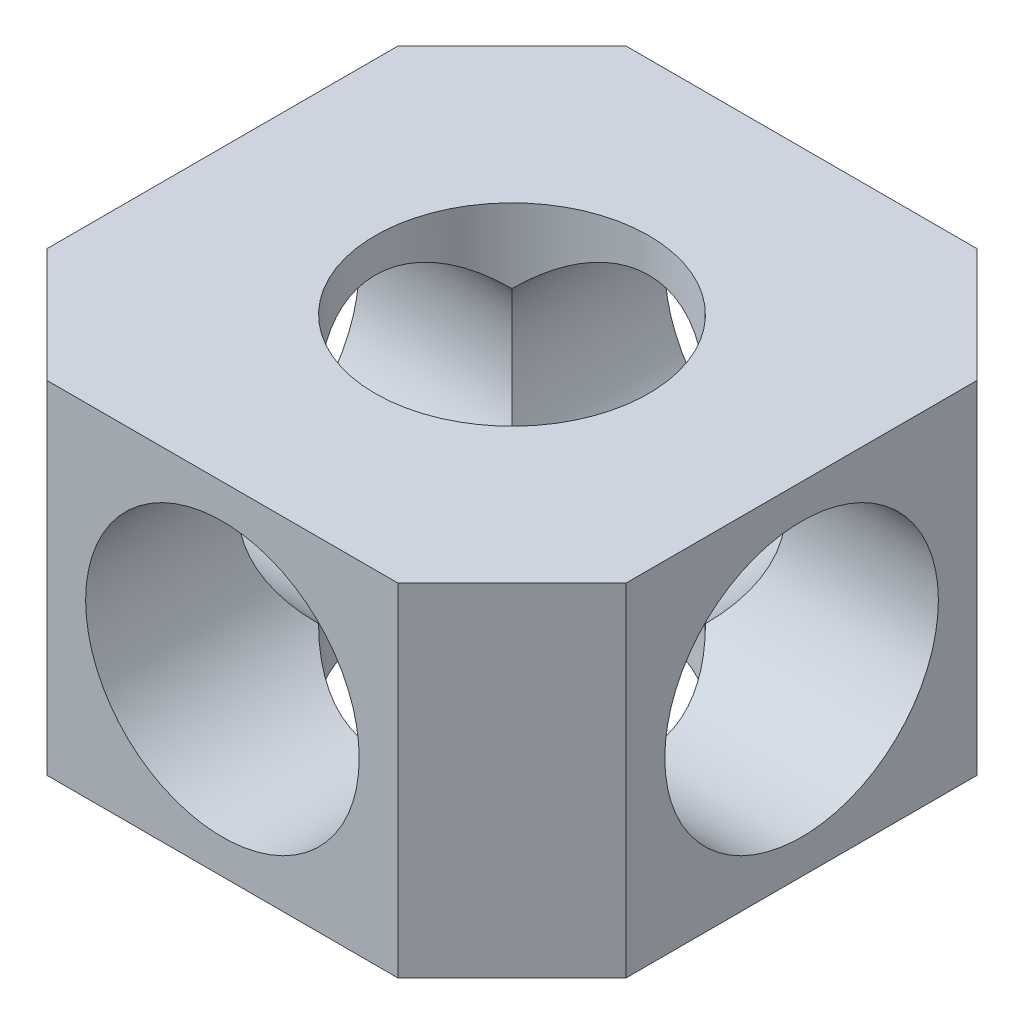
ISO-10303-21;
HEADER;
FILE_DESCRIPTION(('STEP AP214'),'2;1');
FILE_NAME('part.step','',(''),(''),'','','');
FILE_SCHEMA(('AUTOMOTIVE_DESIGN { 1 0 10303 214 1 1 1 1 }'));
ENDSEC;
DATA;
#1=APPLICATION_CONTEXT('core data for automotive mechanical design processes');
#2=APPLICATION_PROTOCOL_DEFINITION('international standard','automotive_design',2000,#1);
#3=PRODUCT_CONTEXT('',#1,'mechanical');
#4=PRODUCT('Part','Part','',(#3));
#5=PRODUCT_RELATED_PRODUCT_CATEGORY('part','',(#4));
#6=PRODUCT_DEFINITION_FORMATION('','',#4);
#7=PRODUCT_DEFINITION_CONTEXT('part definition',#1,'design');
#8=PRODUCT_DEFINITION('design','',#6,#7);
#9=PRODUCT_DEFINITION_SHAPE('','',#8);
#10=(LENGTH_UNIT() NAMED_UNIT(*) SI_UNIT(.MILLI.,.METRE.));
#11=(NAMED_UNIT(*) PLANE_ANGLE_UNIT() SI_UNIT($,.RADIAN.));
#12=(NAMED_UNIT(*) SI_UNIT($,.STERADIAN.) SOLID_ANGLE_UNIT());
#13=UNCERTAINTY_MEASURE_WITH_UNIT(LENGTH_MEASURE(1.E-05),#10,'distance_accuracy_value','');
#14=(GEOMETRIC_REPRESENTATION_CONTEXT(3) GLOBAL_UNCERTAINTY_ASSIGNED_CONTEXT((#13)) GLOBAL_UNIT_ASSIGNED_CONTEXT((#10,
#11,#12)) REPRESENTATION_CONTEXT('',''));
#15=CARTESIAN_POINT('',(0.,0.,0.));
#16=DIRECTION('',(0.,0.,1.));
#17=DIRECTION('',(1.,0.,0.));
#18=AXIS2_PLACEMENT_3D('',#15,#16,#17);
#19=CARTESIAN_POINT('',(0.,7.5,0.));
#20=DIRECTION('',(0.,1.,0.));
#21=DIRECTION('',(0.,0.,1.));
#22=AXIS2_PLACEMENT_3D('',#19,#20,#21);
#23=CYLINDRICAL_SURFACE('',#22,6.00000000000001);
#24=CARTESIAN_POINT('',(0.,7.5,0.));
#25=DIRECTION('',(0.,1.,0.));
#26=DIRECTION('',(0.,0.,1.));
#27=AXIS2_PLACEMENT_3D('',#24,#25,#26);
#28=CIRCLE('',#27,6.00000000000001);
#29=CARTESIAN_POINT('',(0.,7.5,6.00000000000001));
#30=VERTEX_POINT('',#29);
#31=EDGE_CURVE('E181',#30,#30,#28,.T.);
#32=ORIENTED_EDGE('',*,*,#31,.T.);
#33=EDGE_LOOP('',(#32));
#34=FACE_BOUND('',#33,.T.);
#35=CARTESIAN_POINT('',(0.,0.,0.));
#36=DIRECTION('',(0.707106781186547,0.707106781186547,0.));
#37=DIRECTION('',(-0.707106781186547,0.707106781186547,0.));
#38=AXIS2_PLACEMENT_3D('',#35,#36,#37);
#39=ELLIPSE('',#38,8.48528137423858,6.00000000000001);
#40=CARTESIAN_POINT('',(-4.24264068711929,4.24264068711929,4.24264068711929));
#41=VERTEX_POINT('',#40);
#42=CARTESIAN_POINT('',(-4.24264068711929,4.24264068711929,-4.24264068711929));
#43=VERTEX_POINT('',#42);
#44=EDGE_CURVE('E145',#41,#43,#39,.F.);
#45=ORIENTED_EDGE('',*,*,#44,.T.);
#46=CARTESIAN_POINT('',(0.,0.,0.));
#47=DIRECTION('',(0.,0.707106781186547,0.707106781186547));
#48=DIRECTION('',(0.,0.707106781186547,-0.707106781186547));
#49=AXIS2_PLACEMENT_3D('',#46,#47,#48);
#50=ELLIPSE('',#49,8.48528137423858,6.00000000000001);
#51=CARTESIAN_POINT('',(4.24264068711929,4.24264068711929,-4.24264068711929));
#52=VERTEX_POINT('',#51);
#53=EDGE_CURVE('E165',#43,#52,#50,.F.);
#54=ORIENTED_EDGE('',*,*,#53,.T.);
#55=CARTESIAN_POINT('',(0.,0.,0.));
#56=DIRECTION('',(-0.707106781186547,0.707106781186547,0.));
#57=DIRECTION('',(0.707106781186547,0.707106781186547,0.));
#58=AXIS2_PLACEMENT_3D('',#55,#56,#57);
#59=ELLIPSE('',#58,8.48528137423858,6.00000000000001);
#60=CARTESIAN_POINT('',(4.24264068711929,4.24264068711929,4.24264068711929));
#61=VERTEX_POINT('',#60);
#62=EDGE_CURVE('E140',#52,#61,#59,.F.);
#63=ORIENTED_EDGE('',*,*,#62,.T.);
#64=CARTESIAN_POINT('',(0.,0.,0.));
#65=DIRECTION('',(0.,0.707106781186547,-0.707106781186547));
#66=DIRECTION('',(0.,0.707106781186547,0.707106781186547));
#67=AXIS2_PLACEMENT_3D('',#64,#65,#66);
#68=ELLIPSE('',#67,8.48528137423858,6.00000000000001);
#69=EDGE_CURVE('E134',#61,#41,#68,.F.);
#70=ORIENTED_EDGE('',*,*,#69,.T.);
#71=EDGE_LOOP('',(#45,#54,#63,#70));
#72=FACE_BOUND('',#71,.T.);
#73=ADVANCED_FACE('F45',(#34,#72),#23,.F.);
#74=CARTESIAN_POINT('',(12.7,7.5,-12.7));
#75=DIRECTION('',(-1.,0.,0.));
#76=DIRECTION('',(0.,0.,1.));
#77=AXIS2_PLACEMENT_3D('',#74,#75,#76);
#78=PLANE('',#77);
#79=CARTESIAN_POINT('',(12.7,0.,0.));
#80=DIRECTION('',(-1.,0.,0.));
#81=DIRECTION('',(0.,0.,1.));
#82=AXIS2_PLACEMENT_3D('',#79,#80,#81);
#83=CIRCLE('',#82,6.00000000000001);
#84=CARTESIAN_POINT('',(12.7,0.,6.00000000000001));
#85=VERTEX_POINT('',#84);
#86=EDGE_CURVE('E178',#85,#85,#83,.T.);
#87=ORIENTED_EDGE('',*,*,#86,.T.);
#88=EDGE_LOOP('',(#87));
#89=FACE_BOUND('',#88,.T.);
#90=DIRECTION('',(0.,0.,-1.));
#91=VECTOR('',#90,1.);
#92=CARTESIAN_POINT('',(12.7,-7.5,-12.7));
#93=LINE('',#92,#91);
#94=CARTESIAN_POINT('',(12.7,-7.5,7.7));
#95=VERTEX_POINT('',#94);
#96=CARTESIAN_POINT('',(12.7,-7.5,-7.69999999999998));
#97=VERTEX_POINT('',#96);
#98=EDGE_CURVE('E187',#95,#97,#93,.T.);
#99=ORIENTED_EDGE('',*,*,#98,.T.);
#100=DIRECTION('',(0.,1.,0.));
#101=VECTOR('',#100,1.);
#102=CARTESIAN_POINT('',(12.7,7.5,-7.69999999999998));
#103=LINE('',#102,#101);
#104=CARTESIAN_POINT('',(12.7,7.5,-7.69999999999998));
#105=VERTEX_POINT('',#104);
#106=EDGE_CURVE('E151',#97,#105,#103,.T.);
#107=ORIENTED_EDGE('',*,*,#106,.T.);
#108=DIRECTION('',(0.,0.,-1.));
#109=VECTOR('',#108,1.);
#110=CARTESIAN_POINT('',(12.7,7.5,-12.7));
#111=LINE('',#110,#109);
#112=CARTESIAN_POINT('',(12.7,7.5,7.7));
#113=VERTEX_POINT('',#112);
#114=EDGE_CURVE('E188',#113,#105,#111,.T.);
#115=ORIENTED_EDGE('',*,*,#114,.F.);
#116=DIRECTION('',(0.,-1.,0.));
#117=VECTOR('',#116,1.);
#118=CARTESIAN_POINT('',(12.7,7.5,7.7));
#119=LINE('',#118,#117);
#120=EDGE_CURVE('E156',#113,#95,#119,.T.);
#121=ORIENTED_EDGE('',*,*,#120,.T.);
#122=EDGE_LOOP('',(#99,#107,#115,#121));
#123=FACE_BOUND('',#122,.T.);
#124=ADVANCED_FACE('F246',(#89,#123),#78,.F.);
#125=CARTESIAN_POINT('',(-12.7,7.5,-12.7));
#126=DIRECTION('',(0.,0.,1.));
#127=DIRECTION('',(1.,0.,0.));
#128=AXIS2_PLACEMENT_3D('',#125,#126,#127);
#129=PLANE('',#128);
#130=CARTESIAN_POINT('',(0.,0.,-12.7));
#131=DIRECTION('',(0.,0.,1.));
#132=DIRECTION('',(1.,0.,0.));
#133=AXIS2_PLACEMENT_3D('',#130,#131,#132);
#134=CIRCLE('',#133,6.00000000000001);
#135=CARTESIAN_POINT('',(6.00000000000001,0.,-12.7));
#136=VERTEX_POINT('',#135);
#137=EDGE_CURVE('E168',#136,#136,#134,.T.);
#138=ORIENTED_EDGE('',*,*,#137,.T.);
#139=EDGE_LOOP('',(#138));
#140=FACE_BOUND('',#139,.T.);
#141=DIRECTION('',(-1.,0.,0.));
#142=VECTOR('',#141,1.);
#143=CARTESIAN_POINT('',(-12.7,-7.5,-12.7));
#144=LINE('',#143,#142);
#145=CARTESIAN_POINT('',(7.69999999999999,-7.5,-12.7));
#146=VERTEX_POINT('',#145);
#147=CARTESIAN_POINT('',(-7.69999999999998,-7.5,-12.7));
#148=VERTEX_POINT('',#147);
#149=EDGE_CURVE('E204',#146,#148,#144,.T.);
#150=ORIENTED_EDGE('',*,*,#149,.T.);
#151=DIRECTION('',(0.,1.,0.));
#152=VECTOR('',#151,1.);
#153=CARTESIAN_POINT('',(-7.69999999999998,7.5,-12.7));
#154=LINE('',#153,#152);
#155=CARTESIAN_POINT('',(-7.69999999999998,7.5,-12.7));
#156=VERTEX_POINT('',#155);
#157=EDGE_CURVE('E240',#148,#156,#154,.T.);
#158=ORIENTED_EDGE('',*,*,#157,.T.);
#159=DIRECTION('',(-1.,0.,0.));
#160=VECTOR('',#159,1.);
#161=CARTESIAN_POINT('',(-12.7,7.5,-12.7));
#162=LINE('',#161,#160);
#163=CARTESIAN_POINT('',(7.69999999999999,7.5,-12.7));
#164=VERTEX_POINT('',#163);
#165=EDGE_CURVE('E191',#164,#156,#162,.T.);
#166=ORIENTED_EDGE('',*,*,#165,.F.);
#167=DIRECTION('',(0.,-1.,0.));
#168=VECTOR('',#167,1.);
#169=CARTESIAN_POINT('',(7.69999999999999,7.5,-12.7));
#170=LINE('',#169,#168);
#171=EDGE_CURVE('E237',#164,#146,#170,.T.);
#172=ORIENTED_EDGE('',*,*,#171,.T.);
#173=EDGE_LOOP('',(#150,#158,#166,#172));
#174=FACE_BOUND('',#173,.T.);
#175=ADVANCED_FACE('F260',(#140,#174),#129,.F.);
#176=CARTESIAN_POINT('',(-12.7,7.5,-12.7));
#177=DIRECTION('',(1.,0.,0.));
#178=DIRECTION('',(0.,0.,-1.));
#179=AXIS2_PLACEMENT_3D('',#176,#177,#178);
#180=PLANE('',#179);
#181=CARTESIAN_POINT('',(-12.7,0.,0.));
#182=DIRECTION('',(-1.,0.,0.));
#183=DIRECTION('',(0.,0.,1.));
#184=AXIS2_PLACEMENT_3D('',#181,#182,#183);
#185=CIRCLE('',#184,6.00000000000001);
#186=CARTESIAN_POINT('',(-12.7,0.,6.00000000000002));
#187=VERTEX_POINT('',#186);
#188=EDGE_CURVE('E175',#187,#187,#185,.T.);
#189=ORIENTED_EDGE('',*,*,#188,.F.);
#190=EDGE_LOOP('',(#189));
#191=FACE_BOUND('',#190,.T.);
#192=DIRECTION('',(0.,0.,1.));
#193=VECTOR('',#192,1.);
#194=CARTESIAN_POINT('',(-12.7,-7.5,-12.7));
#195=LINE('',#194,#193);
#196=CARTESIAN_POINT('',(-12.7,-7.5,-7.69999999999999));
#197=VERTEX_POINT('',#196);
#198=CARTESIAN_POINT('',(-12.7,-7.5,7.69999999999999));
#199=VERTEX_POINT('',#198);
#200=EDGE_CURVE('E207',#197,#199,#195,.T.);
#201=ORIENTED_EDGE('',*,*,#200,.T.);
#202=DIRECTION('',(0.,1.,0.));
#203=VECTOR('',#202,1.);
#204=CARTESIAN_POINT('',(-12.7,7.5,7.69999999999999));
#205=LINE('',#204,#203);
#206=CARTESIAN_POINT('',(-12.7,7.5,7.69999999999999));
#207=VERTEX_POINT('',#206);
#208=EDGE_CURVE('E227',#199,#207,#205,.T.);
#209=ORIENTED_EDGE('',*,*,#208,.T.);
#210=DIRECTION('',(0.,0.,1.));
#211=VECTOR('',#210,1.);
#212=CARTESIAN_POINT('',(-12.7,7.5,-12.7));
#213=LINE('',#212,#211);
#214=CARTESIAN_POINT('',(-12.7,7.5,-7.69999999999999));
#215=VERTEX_POINT('',#214);
#216=EDGE_CURVE('E195',#215,#207,#213,.T.);
#217=ORIENTED_EDGE('',*,*,#216,.F.);
#218=DIRECTION('',(0.,-1.,0.));
#219=VECTOR('',#218,1.);
#220=CARTESIAN_POINT('',(-12.7,7.5,-7.69999999999999));
#221=LINE('',#220,#219);
#222=EDGE_CURVE('E224',#215,#197,#221,.T.);
#223=ORIENTED_EDGE('',*,*,#222,.T.);
#224=EDGE_LOOP('',(#201,#209,#217,#223));
#225=FACE_BOUND('',#224,.T.);
#226=ADVANCED_FACE('F271',(#191,#225),#180,.F.);
#227=CARTESIAN_POINT('',(-12.7,7.5,12.7));
#228=DIRECTION('',(0.,0.,-1.));
#229=DIRECTION('',(-1.,0.,0.));
#230=AXIS2_PLACEMENT_3D('',#227,#228,#229);
#231=PLANE('',#230);
#232=CARTESIAN_POINT('',(0.,0.,12.7));
#233=DIRECTION('',(0.,0.,1.));
#234=DIRECTION('',(1.,0.,0.));
#235=AXIS2_PLACEMENT_3D('',#232,#233,#234);
#236=CIRCLE('',#235,6.00000000000001);
#237=CARTESIAN_POINT('',(6.00000000000001,0.,12.7));
#238=VERTEX_POINT('',#237);
#239=EDGE_CURVE('E391',#238,#238,#236,.T.);
#240=ORIENTED_EDGE('',*,*,#239,.F.);
#241=EDGE_LOOP('',(#240));
#242=FACE_BOUND('',#241,.T.);
#243=DIRECTION('',(1.,0.,0.));
#244=VECTOR('',#243,1.);
#245=CARTESIAN_POINT('',(-12.7,7.5,12.7));
#246=LINE('',#245,#244);
#247=CARTESIAN_POINT('',(-7.7,7.5,12.7));
#248=VERTEX_POINT('',#247);
#249=CARTESIAN_POINT('',(7.69999999999999,7.5,12.7));
#250=VERTEX_POINT('',#249);
#251=EDGE_CURVE('E198',#248,#250,#246,.T.);
#252=ORIENTED_EDGE('',*,*,#251,.F.);
#253=DIRECTION('',(0.,-1.,0.));
#254=VECTOR('',#253,1.);
#255=CARTESIAN_POINT('',(-7.7,7.5,12.7));
#256=LINE('',#255,#254);
#257=CARTESIAN_POINT('',(-7.7,-7.5,12.7));
#258=VERTEX_POINT('',#257);
#259=EDGE_CURVE('E213',#248,#258,#256,.T.);
#260=ORIENTED_EDGE('',*,*,#259,.T.);
#261=DIRECTION('',(1.,0.,0.));
#262=VECTOR('',#261,1.);
#263=CARTESIAN_POINT('',(-12.7,-7.5,12.7));
#264=LINE('',#263,#262);
#265=CARTESIAN_POINT('',(7.69999999999999,-7.5,12.7));
#266=VERTEX_POINT('',#265);
#267=EDGE_CURVE('E192',#258,#266,#264,.T.);
#268=ORIENTED_EDGE('',*,*,#267,.T.);
#269=DIRECTION('',(0.,1.,0.));
#270=VECTOR('',#269,1.);
#271=CARTESIAN_POINT('',(7.69999999999999,7.5,12.7));
#272=LINE('',#271,#270);
#273=EDGE_CURVE('E201',#266,#250,#272,.T.);
#274=ORIENTED_EDGE('',*,*,#273,.T.);
#275=EDGE_LOOP('',(#252,#260,#268,#274));
#276=FACE_BOUND('',#275,.T.);
#277=ADVANCED_FACE('F279',(#242,#276),#231,.F.);
#278=CARTESIAN_POINT('',(0.,7.5,0.));
#279=DIRECTION('',(0.,1.,0.));
#280=DIRECTION('',(0.,0.,1.));
#281=AXIS2_PLACEMENT_3D('',#278,#279,#280);
#282=PLANE('',#281);
#283=ORIENTED_EDGE('',*,*,#31,.F.);
#284=EDGE_LOOP('',(#283));
#285=FACE_BOUND('',#284,.T.);
#286=ORIENTED_EDGE('',*,*,#216,.T.);
#287=DIRECTION('',(-0.707106781186546,0.,-0.707106781186549));
#288=VECTOR('',#287,1.);
#289=CARTESIAN_POINT('',(-10.2,7.5,10.2));
#290=LINE('',#289,#288);
#291=EDGE_CURVE('E235',#207,#248,#290,.F.);
#292=ORIENTED_EDGE('',*,*,#291,.T.);
#293=ORIENTED_EDGE('',*,*,#251,.T.);
#294=DIRECTION('',(-0.707106781186548,0.,0.707106781186547));
#295=VECTOR('',#294,1.);
#296=CARTESIAN_POINT('',(10.2,7.5,10.2));
#297=LINE('',#296,#295);
#298=EDGE_CURVE('E229',#250,#113,#297,.F.);
#299=ORIENTED_EDGE('',*,*,#298,.T.);
#300=ORIENTED_EDGE('',*,*,#114,.T.);
#301=DIRECTION('',(0.707106781186547,0.,0.707106781186549));
#302=VECTOR('',#301,1.);
#303=CARTESIAN_POINT('',(10.2,7.5,-10.2));
#304=LINE('',#303,#302);
#305=EDGE_CURVE('E231',#105,#164,#304,.F.);
#306=ORIENTED_EDGE('',*,*,#305,.T.);
#307=ORIENTED_EDGE('',*,*,#165,.T.);
#308=DIRECTION('',(0.707106781186549,0.,-0.707106781186546));
#309=VECTOR('',#308,1.);
#310=CARTESIAN_POINT('',(-10.2,7.5,-10.2));
#311=LINE('',#310,#309);
#312=EDGE_CURVE('E233',#156,#215,#311,.F.);
#313=ORIENTED_EDGE('',*,*,#312,.T.);
#314=EDGE_LOOP('',(#286,#292,#293,#299,#300,#306,#307,#313));
#315=FACE_BOUND('',#314,.T.);
#316=ADVANCED_FACE('F264',(#285,#315),#282,.T.);
#317=CARTESIAN_POINT('',(0.,-7.5,0.));
#318=DIRECTION('',(0.,1.,0.));
#319=DIRECTION('',(0.,0.,1.));
#320=AXIS2_PLACEMENT_3D('',#317,#318,#319);
#321=PLANE('',#320);
#322=CARTESIAN_POINT('',(0.,-7.5,0.));
#323=DIRECTION('',(0.,1.,0.));
#324=DIRECTION('',(0.,0.,1.));
#325=AXIS2_PLACEMENT_3D('',#322,#323,#324);
#326=CIRCLE('',#325,6.00000000000001);
#327=CARTESIAN_POINT('',(0.,-7.5,6.00000000000001));
#328=VERTEX_POINT('',#327);
#329=EDGE_CURVE('E184',#328,#328,#326,.T.);
#330=ORIENTED_EDGE('',*,*,#329,.T.);
#331=EDGE_LOOP('',(#330));
#332=FACE_BOUND('',#331,.T.);
#333=ORIENTED_EDGE('',*,*,#267,.F.);
#334=DIRECTION('',(0.707106781186546,0.,0.707106781186549));
#335=VECTOR('',#334,1.);
#336=CARTESIAN_POINT('',(-7.7,-7.5,12.7));
#337=LINE('',#336,#335);
#338=EDGE_CURVE('E222',#258,#199,#337,.F.);
#339=ORIENTED_EDGE('',*,*,#338,.T.);
#340=ORIENTED_EDGE('',*,*,#200,.F.);
#341=DIRECTION('',(-0.707106781186549,0.,0.707106781186546));
#342=VECTOR('',#341,1.);
#343=CARTESIAN_POINT('',(-12.7,-7.5,-7.69999999999999));
#344=LINE('',#343,#342);
#345=EDGE_CURVE('E220',#197,#148,#344,.F.);
#346=ORIENTED_EDGE('',*,*,#345,.T.);
#347=ORIENTED_EDGE('',*,*,#149,.F.);
#348=DIRECTION('',(-0.707106781186547,0.,-0.707106781186549));
#349=VECTOR('',#348,1.);
#350=CARTESIAN_POINT('',(7.69999999999999,-7.5,-12.7));
#351=LINE('',#350,#349);
#352=EDGE_CURVE('E218',#146,#97,#351,.F.);
#353=ORIENTED_EDGE('',*,*,#352,.T.);
#354=ORIENTED_EDGE('',*,*,#98,.F.);
#355=DIRECTION('',(0.707106781186548,0.,-0.707106781186547));
#356=VECTOR('',#355,1.);
#357=CARTESIAN_POINT('',(12.7,-7.5,7.7));
#358=LINE('',#357,#356);
#359=EDGE_CURVE('E216',#95,#266,#358,.F.);
#360=ORIENTED_EDGE('',*,*,#359,.T.);
#361=EDGE_LOOP('',(#333,#339,#340,#346,#347,#353,#354,#360));
#362=FACE_BOUND('',#361,.T.);
#363=ADVANCED_FACE('F252',(#332,#362),#321,.F.);
#364=CARTESIAN_POINT('',(-7.7,7.5,12.7));
#365=DIRECTION('',(0.707106781186549,0.,-0.707106781186546));
#366=DIRECTION('',(0.,-1.,0.));
#367=AXIS2_PLACEMENT_3D('',#364,#365,#366);
#368=PLANE('',#367);
#369=ORIENTED_EDGE('',*,*,#291,.F.);
#370=ORIENTED_EDGE('',*,*,#208,.F.);
#371=ORIENTED_EDGE('',*,*,#338,.F.);
#372=ORIENTED_EDGE('',*,*,#259,.F.);
#373=EDGE_LOOP('',(#369,#370,#371,#372));
#374=FACE_BOUND('',#373,.T.);
#375=ADVANCED_FACE('F276',(#374),#368,.F.);
#376=CARTESIAN_POINT('',(-12.7,7.5,-7.69999999999999));
#377=DIRECTION('',(0.707106781186546,0.,0.707106781186549));
#378=DIRECTION('',(0.,-1.,0.));
#379=AXIS2_PLACEMENT_3D('',#376,#377,#378);
#380=PLANE('',#379);
#381=ORIENTED_EDGE('',*,*,#312,.F.);
#382=ORIENTED_EDGE('',*,*,#157,.F.);
#383=ORIENTED_EDGE('',*,*,#345,.F.);
#384=ORIENTED_EDGE('',*,*,#222,.F.);
#385=EDGE_LOOP('',(#381,#382,#383,#384));
#386=FACE_BOUND('',#385,.T.);
#387=ADVANCED_FACE('F268',(#386),#380,.F.);
#388=CARTESIAN_POINT('',(7.69999999999999,7.5,-12.7));
#389=DIRECTION('',(-0.707106781186549,0.,0.707106781186547));
#390=DIRECTION('',(0.,-1.,0.));
#391=AXIS2_PLACEMENT_3D('',#388,#389,#390);
#392=PLANE('',#391);
#393=ORIENTED_EDGE('',*,*,#305,.F.);
#394=ORIENTED_EDGE('',*,*,#106,.F.);
#395=ORIENTED_EDGE('',*,*,#352,.F.);
#396=ORIENTED_EDGE('',*,*,#171,.F.);
#397=EDGE_LOOP('',(#393,#394,#395,#396));
#398=FACE_BOUND('',#397,.T.);
#399=ADVANCED_FACE('F257',(#398),#392,.F.);
#400=CARTESIAN_POINT('',(12.7,7.5,7.7));
#401=DIRECTION('',(-0.707106781186547,0.,-0.707106781186548));
#402=DIRECTION('',(0.,-1.,0.));
#403=AXIS2_PLACEMENT_3D('',#400,#401,#402);
#404=PLANE('',#403);
#405=ORIENTED_EDGE('',*,*,#298,.F.);
#406=ORIENTED_EDGE('',*,*,#273,.F.);
#407=ORIENTED_EDGE('',*,*,#359,.F.);
#408=ORIENTED_EDGE('',*,*,#120,.F.);
#409=EDGE_LOOP('',(#405,#406,#407,#408));
#410=FACE_BOUND('',#409,.T.);
#411=ADVANCED_FACE('F48',(#410),#404,.F.);
#412=CARTESIAN_POINT('',(0.,0.,0.));
#413=DIRECTION('',(-0.707106781186547,0.707106781186547,0.));
#414=DIRECTION('',(0.707106781186547,0.707106781186547,0.));
#415=AXIS2_PLACEMENT_3D('',#412,#413,#414);
#416=ELLIPSE('',#415,8.48528137423858,6.00000000000001);
#417=CARTESIAN_POINT('',(-4.24264068711929,-4.24264068711929,-4.24264068711929));
#418=VERTEX_POINT('',#417);
#419=CARTESIAN_POINT('',(-4.24264068711929,-4.24264068711929,4.24264068711929));
#420=VERTEX_POINT('',#419);
#421=EDGE_CURVE('E154',#418,#420,#416,.T.);
#422=ORIENTED_EDGE('',*,*,#421,.T.);
#423=CARTESIAN_POINT('',(0.,0.,0.));
#424=DIRECTION('',(0.,0.707106781186547,0.707106781186547));
#425=DIRECTION('',(0.,0.707106781186547,-0.707106781186547));
#426=AXIS2_PLACEMENT_3D('',#423,#424,#425);
#427=ELLIPSE('',#426,8.48528137423858,6.00000000000001);
#428=CARTESIAN_POINT('',(4.24264068711929,-4.24264068711929,4.24264068711929));
#429=VERTEX_POINT('',#428);
#430=EDGE_CURVE('E69',#420,#429,#427,.T.);
#431=ORIENTED_EDGE('',*,*,#430,.T.);
#432=CARTESIAN_POINT('',(0.,0.,0.));
#433=DIRECTION('',(0.707106781186547,0.707106781186547,0.));
#434=DIRECTION('',(-0.707106781186547,0.707106781186547,0.));
#435=AXIS2_PLACEMENT_3D('',#432,#433,#434);
#436=ELLIPSE('',#435,8.48528137423858,6.00000000000001);
#437=CARTESIAN_POINT('',(4.24264068711929,-4.24264068711929,-4.24264068711929));
#438=VERTEX_POINT('',#437);
#439=EDGE_CURVE('E150',#429,#438,#436,.T.);
#440=ORIENTED_EDGE('',*,*,#439,.T.);
#441=CARTESIAN_POINT('',(0.,0.,0.));
#442=DIRECTION('',(0.,0.707106781186547,-0.707106781186547));
#443=DIRECTION('',(0.,0.707106781186547,0.707106781186547));
#444=AXIS2_PLACEMENT_3D('',#441,#442,#443);
#445=ELLIPSE('',#444,8.48528137423858,6.00000000000001);
#446=EDGE_CURVE('E61',#438,#418,#445,.T.);
#447=ORIENTED_EDGE('',*,*,#446,.T.);
#448=EDGE_LOOP('',(#422,#431,#440,#447));
#449=FACE_BOUND('',#448,.T.);
#450=ORIENTED_EDGE('',*,*,#329,.F.);
#451=EDGE_LOOP('',(#450));
#452=FACE_BOUND('',#451,.T.);
#453=ADVANCED_FACE('F162',(#449,#452),#23,.F.);
#454=CARTESIAN_POINT('',(-12.7,0.,0.));
#455=DIRECTION('',(-1.,0.,0.));
#456=DIRECTION('',(0.,0.,1.));
#457=AXIS2_PLACEMENT_3D('',#454,#455,#456);
#458=CYLINDRICAL_SURFACE('',#457,6.00000000000001);
#459=ORIENTED_EDGE('',*,*,#188,.T.);
#460=EDGE_LOOP('',(#459));
#461=FACE_BOUND('',#460,.T.);
#462=ORIENTED_EDGE('',*,*,#421,.F.);
#463=CARTESIAN_POINT('',(0.,0.,0.));
#464=DIRECTION('',(-0.707106781186547,0.,0.707106781186548));
#465=DIRECTION('',(-0.707106781186548,0.,-0.707106781186547));
#466=AXIS2_PLACEMENT_3D('',#463,#464,#465);
#467=ELLIPSE('',#466,8.48528137423858,6.00000000000001);
#468=EDGE_CURVE('E11',#418,#43,#467,.F.);
#469=ORIENTED_EDGE('',*,*,#468,.T.);
#470=ORIENTED_EDGE('',*,*,#44,.F.);
#471=CARTESIAN_POINT('',(0.,0.,0.));
#472=DIRECTION('',(-0.707106781186548,0.,-0.707106781186547));
#473=DIRECTION('',(-0.707106781186547,0.,0.707106781186548));
#474=AXIS2_PLACEMENT_3D('',#471,#472,#473);
#475=ELLIPSE('',#474,8.48528137423858,6.00000000000001);
#476=EDGE_CURVE('E54',#41,#420,#475,.F.);
#477=ORIENTED_EDGE('',*,*,#476,.T.);
#478=EDGE_LOOP('',(#462,#469,#470,#477));
#479=FACE_BOUND('',#478,.T.);
#480=ADVANCED_FACE('F149',(#461,#479),#458,.F.);
#481=ORIENTED_EDGE('',*,*,#439,.F.);
#482=CARTESIAN_POINT('',(0.,0.,0.));
#483=DIRECTION('',(-0.707106781186547,0.,0.707106781186548));
#484=DIRECTION('',(-0.707106781186548,0.,-0.707106781186547));
#485=AXIS2_PLACEMENT_3D('',#482,#483,#484);
#486=ELLIPSE('',#485,8.48528137423858,6.00000000000001);
#487=EDGE_CURVE('E147',#429,#61,#486,.T.);
#488=ORIENTED_EDGE('',*,*,#487,.T.);
#489=ORIENTED_EDGE('',*,*,#62,.F.);
#490=CARTESIAN_POINT('',(0.,0.,0.));
#491=DIRECTION('',(-0.707106781186548,0.,-0.707106781186547));
#492=DIRECTION('',(-0.707106781186547,0.,0.707106781186548));
#493=AXIS2_PLACEMENT_3D('',#490,#491,#492);
#494=ELLIPSE('',#493,8.48528137423858,6.00000000000001);
#495=EDGE_CURVE('E166',#52,#438,#494,.T.);
#496=ORIENTED_EDGE('',*,*,#495,.T.);
#497=EDGE_LOOP('',(#481,#488,#489,#496));
#498=FACE_BOUND('',#497,.T.);
#499=ORIENTED_EDGE('',*,*,#86,.F.);
#500=EDGE_LOOP('',(#499));
#501=FACE_BOUND('',#500,.T.);
#502=ADVANCED_FACE('F299',(#498,#501),#458,.F.);
#503=CARTESIAN_POINT('',(0.,0.,12.7));
#504=DIRECTION('',(0.,0.,1.));
#505=DIRECTION('',(1.,0.,0.));
#506=AXIS2_PLACEMENT_3D('',#503,#504,#505);
#507=CYLINDRICAL_SURFACE('',#506,6.00000000000001);
#508=ORIENTED_EDGE('',*,*,#239,.T.);
#509=EDGE_LOOP('',(#508));
#510=FACE_BOUND('',#509,.T.);
#511=ORIENTED_EDGE('',*,*,#430,.F.);
#512=ORIENTED_EDGE('',*,*,#476,.F.);
#513=ORIENTED_EDGE('',*,*,#69,.F.);
#514=ORIENTED_EDGE('',*,*,#487,.F.);
#515=EDGE_LOOP('',(#511,#512,#513,#514));
#516=FACE_BOUND('',#515,.T.);
#517=ADVANCED_FACE('F133',(#510,#516),#507,.F.);
#518=ORIENTED_EDGE('',*,*,#468,.F.);
#519=ORIENTED_EDGE('',*,*,#446,.F.);
#520=ORIENTED_EDGE('',*,*,#495,.F.);
#521=ORIENTED_EDGE('',*,*,#53,.F.);
#522=EDGE_LOOP('',(#518,#519,#520,#521));
#523=FACE_BOUND('',#522,.T.);
#524=ORIENTED_EDGE('',*,*,#137,.F.);
#525=EDGE_LOOP('',(#524));
#526=FACE_BOUND('',#525,.T.);
#527=ADVANCED_FACE('F376',(#523,#526),#507,.F.);
#528=CLOSED_SHELL('',(#73,#124,#175,#226,#277,#316,#363,#375,#387,#399,#411,#453,#480,#502,#517,#527));
#529=MANIFOLD_SOLID_BREP('B2',#528);
#530=ADVANCED_BREP_SHAPE_REPRESENTATION('',(#18,#529),#14);
#531=SHAPE_DEFINITION_REPRESENTATION(#9,#530);
ENDSEC;
END-ISO-10303-21;
